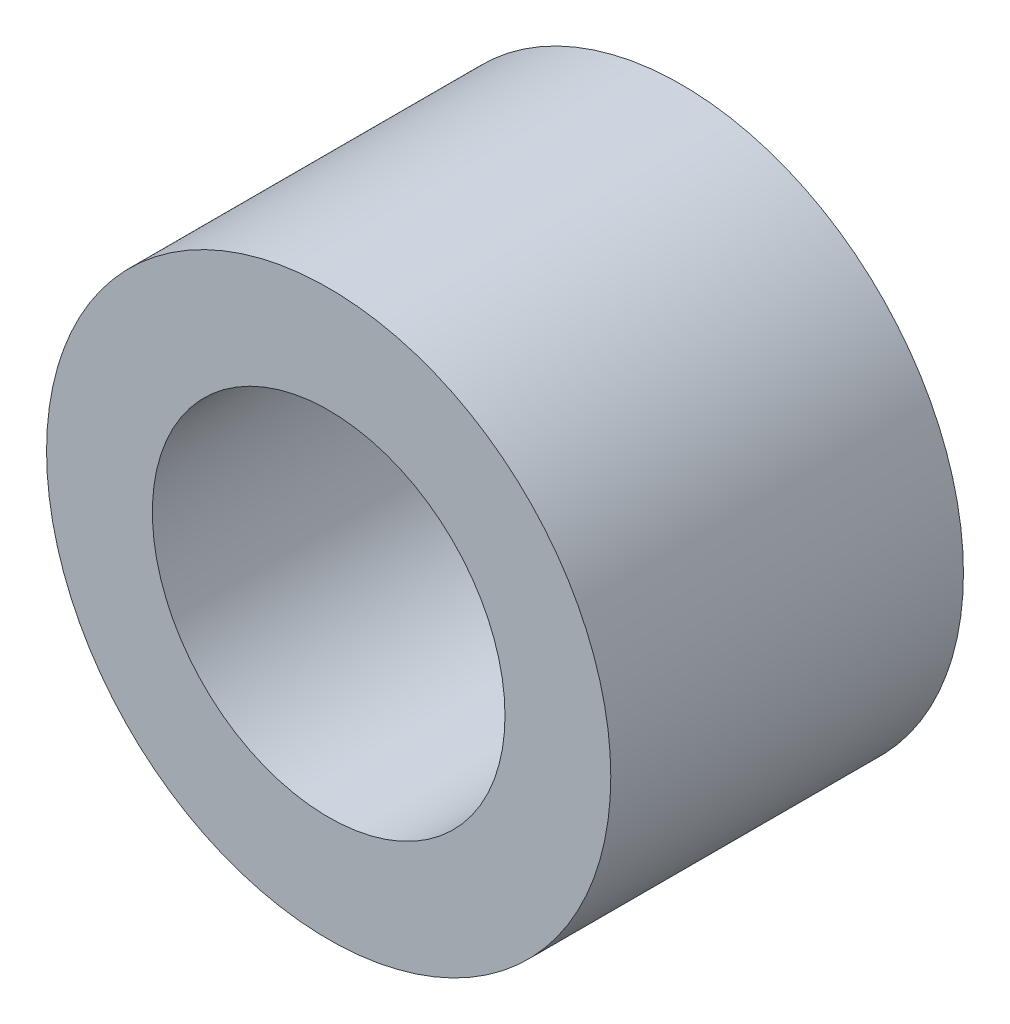
ISO-10303-21;
HEADER;
FILE_DESCRIPTION(('STEP AP214'),'2;1');
FILE_NAME('part.step','',(''),(''),'','','');
FILE_SCHEMA(('AUTOMOTIVE_DESIGN { 1 0 10303 214 1 1 1 1 }'));
ENDSEC;
DATA;
#1=APPLICATION_CONTEXT('core data for automotive mechanical design processes');
#2=APPLICATION_PROTOCOL_DEFINITION('international standard','automotive_design',2000,#1);
#3=PRODUCT_CONTEXT('',#1,'mechanical');
#4=PRODUCT('Part','Part','',(#3));
#5=PRODUCT_RELATED_PRODUCT_CATEGORY('part','',(#4));
#6=PRODUCT_DEFINITION_FORMATION('','',#4);
#7=PRODUCT_DEFINITION_CONTEXT('part definition',#1,'design');
#8=PRODUCT_DEFINITION('design','',#6,#7);
#9=PRODUCT_DEFINITION_SHAPE('','',#8);
#10=(LENGTH_UNIT() NAMED_UNIT(*) SI_UNIT(.MILLI.,.METRE.));
#11=(NAMED_UNIT(*) PLANE_ANGLE_UNIT() SI_UNIT($,.RADIAN.));
#12=(NAMED_UNIT(*) SI_UNIT($,.STERADIAN.) SOLID_ANGLE_UNIT());
#13=UNCERTAINTY_MEASURE_WITH_UNIT(LENGTH_MEASURE(1.E-05),#10,'distance_accuracy_value','');
#14=(GEOMETRIC_REPRESENTATION_CONTEXT(3) GLOBAL_UNCERTAINTY_ASSIGNED_CONTEXT((#13)) GLOBAL_UNIT_ASSIGNED_CONTEXT((#10,
#11,#12)) REPRESENTATION_CONTEXT('',''));
#15=CARTESIAN_POINT('',(0.,0.,0.));
#16=DIRECTION('',(0.,0.,1.));
#17=DIRECTION('',(1.,0.,0.));
#18=AXIS2_PLACEMENT_3D('',#15,#16,#17);
#19=CARTESIAN_POINT('',(0.,0.,5.));
#20=DIRECTION('',(0.,0.,1.));
#21=DIRECTION('',(1.,0.,0.));
#22=AXIS2_PLACEMENT_3D('',#19,#20,#21);
#23=PLANE('',#22);
#24=CARTESIAN_POINT('',(0.,0.,5.));
#25=DIRECTION('',(0.,0.,1.));
#26=DIRECTION('',(1.,0.,0.));
#27=AXIS2_PLACEMENT_3D('',#24,#25,#26);
#28=CIRCLE('',#27,4.);
#29=CARTESIAN_POINT('',(4.,0.,5.));
#30=VERTEX_POINT('',#29);
#31=EDGE_CURVE('E10',#30,#30,#28,.T.);
#32=ORIENTED_EDGE('',*,*,#31,.T.);
#33=EDGE_LOOP('',(#32));
#34=FACE_BOUND('',#33,.T.);
#35=CARTESIAN_POINT('',(0.,0.,5.));
#36=DIRECTION('',(0.,0.,1.));
#37=DIRECTION('',(1.,0.,0.));
#38=AXIS2_PLACEMENT_3D('',#35,#36,#37);
#39=CIRCLE('',#38,2.5);
#40=CARTESIAN_POINT('',(2.5,0.,5.));
#41=VERTEX_POINT('',#40);
#42=EDGE_CURVE('E46',#41,#41,#39,.T.);
#43=ORIENTED_EDGE('',*,*,#42,.F.);
#44=EDGE_LOOP('',(#43));
#45=FACE_BOUND('',#44,.T.);
#46=ADVANCED_FACE('F35',(#34,#45),#23,.T.);
#47=CARTESIAN_POINT('',(0.,0.,0.));
#48=DIRECTION('',(0.,0.,1.));
#49=DIRECTION('',(1.,0.,0.));
#50=AXIS2_PLACEMENT_3D('',#47,#48,#49);
#51=PLANE('',#50);
#52=CARTESIAN_POINT('',(0.,0.,0.));
#53=DIRECTION('',(0.,0.,1.));
#54=DIRECTION('',(1.,0.,0.));
#55=AXIS2_PLACEMENT_3D('',#52,#53,#54);
#56=CIRCLE('',#55,4.);
#57=CARTESIAN_POINT('',(4.,0.,0.));
#58=VERTEX_POINT('',#57);
#59=EDGE_CURVE('E39',#58,#58,#56,.T.);
#60=ORIENTED_EDGE('',*,*,#59,.F.);
#61=EDGE_LOOP('',(#60));
#62=FACE_BOUND('',#61,.T.);
#63=CARTESIAN_POINT('',(0.,0.,0.));
#64=DIRECTION('',(0.,0.,1.));
#65=DIRECTION('',(1.,0.,0.));
#66=AXIS2_PLACEMENT_3D('',#63,#64,#65);
#67=CIRCLE('',#66,2.5);
#68=CARTESIAN_POINT('',(2.5,0.,0.));
#69=VERTEX_POINT('',#68);
#70=EDGE_CURVE('E48',#69,#69,#67,.T.);
#71=ORIENTED_EDGE('',*,*,#70,.T.);
#72=EDGE_LOOP('',(#71));
#73=FACE_BOUND('',#72,.T.);
#74=ADVANCED_FACE('F58',(#62,#73),#51,.F.);
#75=CARTESIAN_POINT('',(0.,0.,5.));
#76=DIRECTION('',(0.,0.,-1.));
#77=DIRECTION('',(-1.,0.,0.));
#78=AXIS2_PLACEMENT_3D('',#75,#76,#77);
#79=CYLINDRICAL_SURFACE('',#78,4.);
#80=ORIENTED_EDGE('',*,*,#31,.F.);
#81=EDGE_LOOP('',(#80));
#82=FACE_BOUND('',#81,.T.);
#83=ORIENTED_EDGE('',*,*,#59,.T.);
#84=EDGE_LOOP('',(#83));
#85=FACE_BOUND('',#84,.T.);
#86=ADVANCED_FACE('F37',(#82,#85),#79,.T.);
#87=CARTESIAN_POINT('',(0.,0.,5.));
#88=DIRECTION('',(0.,0.,-1.));
#89=DIRECTION('',(-1.,0.,0.));
#90=AXIS2_PLACEMENT_3D('',#87,#88,#89);
#91=CYLINDRICAL_SURFACE('',#90,2.5);
#92=ORIENTED_EDGE('',*,*,#42,.T.);
#93=EDGE_LOOP('',(#92));
#94=FACE_BOUND('',#93,.T.);
#95=ORIENTED_EDGE('',*,*,#70,.F.);
#96=EDGE_LOOP('',(#95));
#97=FACE_BOUND('',#96,.T.);
#98=ADVANCED_FACE('F54',(#94,#97),#91,.F.);
#99=CLOSED_SHELL('',(#46,#74,#86,#98));
#100=MANIFOLD_SOLID_BREP('B2',#99);
#101=ADVANCED_BREP_SHAPE_REPRESENTATION('',(#18,#100),#14);
#102=SHAPE_DEFINITION_REPRESENTATION(#9,#101);
ENDSEC;
END-ISO-10303-21;
